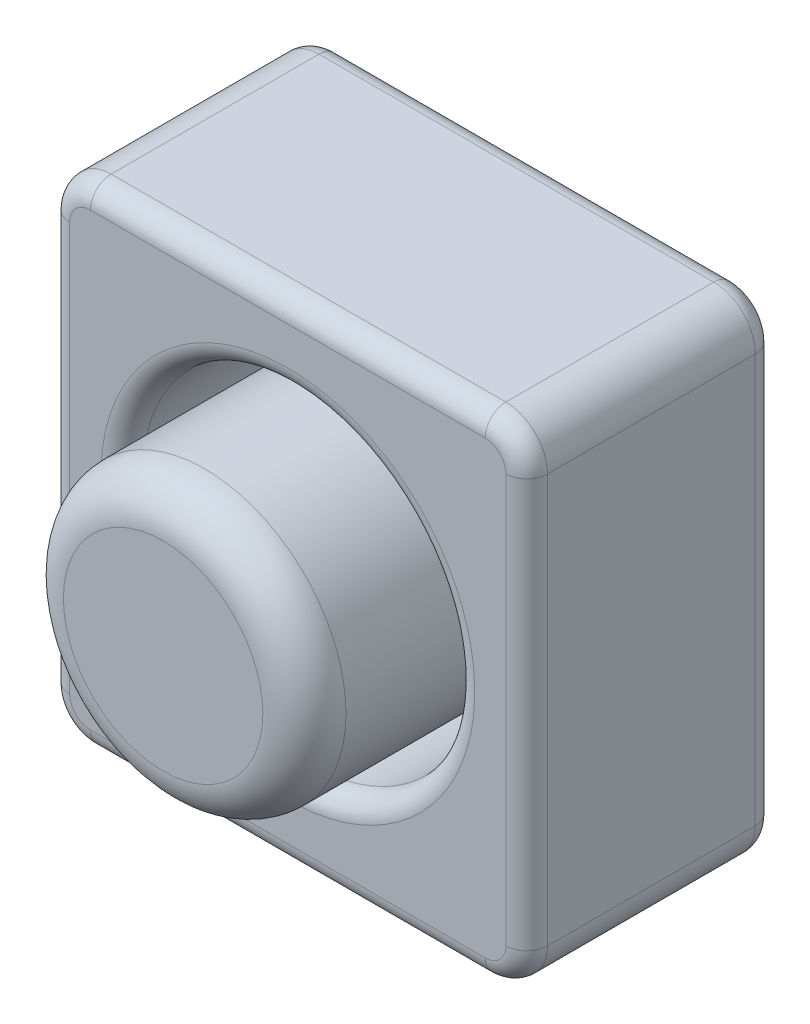
ISO-10303-21;
HEADER;
FILE_DESCRIPTION(('STEP AP214'),'2;1');
FILE_NAME('part.step','',(''),(''),'','','');
FILE_SCHEMA(('AUTOMOTIVE_DESIGN { 1 0 10303 214 1 1 1 1 }'));
ENDSEC;
DATA;
#1=APPLICATION_CONTEXT('core data for automotive mechanical design processes');
#2=APPLICATION_PROTOCOL_DEFINITION('international standard','automotive_design',2000,#1);
#3=PRODUCT_CONTEXT('',#1,'mechanical');
#4=PRODUCT('Part','Part','',(#3));
#5=PRODUCT_RELATED_PRODUCT_CATEGORY('part','',(#4));
#6=PRODUCT_DEFINITION_FORMATION('','',#4);
#7=PRODUCT_DEFINITION_CONTEXT('part definition',#1,'design');
#8=PRODUCT_DEFINITION('design','',#6,#7);
#9=PRODUCT_DEFINITION_SHAPE('','',#8);
#10=(LENGTH_UNIT() NAMED_UNIT(*) SI_UNIT(.MILLI.,.METRE.));
#11=(NAMED_UNIT(*) PLANE_ANGLE_UNIT() SI_UNIT($,.RADIAN.));
#12=(NAMED_UNIT(*) SI_UNIT($,.STERADIAN.) SOLID_ANGLE_UNIT());
#13=UNCERTAINTY_MEASURE_WITH_UNIT(LENGTH_MEASURE(1.E-05),#10,'distance_accuracy_value','');
#14=(GEOMETRIC_REPRESENTATION_CONTEXT(3) GLOBAL_UNCERTAINTY_ASSIGNED_CONTEXT((#13)) GLOBAL_UNIT_ASSIGNED_CONTEXT((#10,
#11,#12)) REPRESENTATION_CONTEXT('',''));
#15=CARTESIAN_POINT('',(0.,0.,0.));
#16=DIRECTION('',(0.,0.,1.));
#17=DIRECTION('',(1.,0.,0.));
#18=AXIS2_PLACEMENT_3D('',#15,#16,#17);
#19=CARTESIAN_POINT('',(-14.8289115387548,-6.46149501276,0.9));
#20=DIRECTION('',(0.,0.,-1.));
#21=DIRECTION('',(-1.,0.,0.));
#22=AXIS2_PLACEMENT_3D('',#19,#20,#21);
#23=PLANE('',#22);
#24=CARTESIAN_POINT('',(-17.3287625004657,-6.33649501276,0.9));
#25=DIRECTION('',(0.,0.,-1.));
#26=DIRECTION('',(-1.,0.,0.));
#27=AXIS2_PLACEMENT_3D('',#24,#25,#26);
#28=CIRCLE('',#27,0.125);
#29=CARTESIAN_POINT('',(-17.4537625004657,-6.33649501276,0.9));
#30=VERTEX_POINT('',#29);
#31=CARTESIAN_POINT('',(-17.3287625004657,-6.46149501276,0.9));
#32=VERTEX_POINT('',#31);
#33=EDGE_CURVE('E295',#30,#32,#28,.F.);
#34=ORIENTED_EDGE('',*,*,#33,.F.);
#35=DIRECTION('',(0.,-1.,0.));
#36=VECTOR('',#35,1.);
#37=CARTESIAN_POINT('',(-17.4537625004657,-5.10719648693996,0.899999999999999));
#38=LINE('',#37,#36);
#39=CARTESIAN_POINT('',(-17.4537625004657,-3.87789796111991,0.9));
#40=VERTEX_POINT('',#39);
#41=EDGE_CURVE('E309',#40,#30,#38,.T.);
#42=ORIENTED_EDGE('',*,*,#41,.F.);
#43=CARTESIAN_POINT('',(-17.3287625004657,-3.87789796111991,0.900000000000002));
#44=DIRECTION('',(0.,0.,-1.));
#45=DIRECTION('',(-1.,0.,0.));
#46=AXIS2_PLACEMENT_3D('',#43,#44,#45);
#47=CIRCLE('',#46,0.125);
#48=CARTESIAN_POINT('',(-17.3287625004657,-3.75289796111991,0.900000000000001));
#49=VERTEX_POINT('',#48);
#50=EDGE_CURVE('E319',#49,#40,#47,.F.);
#51=ORIENTED_EDGE('',*,*,#50,.F.);
#52=DIRECTION('',(-1.,0.,0.));
#53=VECTOR('',#52,1.);
#54=CARTESIAN_POINT('',(-16.1413370196103,-3.75289796111991,0.9));
#55=LINE('',#54,#53);
#56=CARTESIAN_POINT('',(-14.9539115387548,-3.75289796111991,0.900000000000001));
#57=VERTEX_POINT('',#56);
#58=EDGE_CURVE('E329',#57,#49,#55,.T.);
#59=ORIENTED_EDGE('',*,*,#58,.F.);
#60=CARTESIAN_POINT('',(-14.9539115387548,-3.87789796111991,0.900000000000001));
#61=DIRECTION('',(0.,0.,-1.));
#62=DIRECTION('',(-1.,0.,0.));
#63=AXIS2_PLACEMENT_3D('',#60,#61,#62);
#64=CIRCLE('',#63,0.125000000000002);
#65=CARTESIAN_POINT('',(-14.8289115387548,-3.87789796111991,0.9));
#66=VERTEX_POINT('',#65);
#67=EDGE_CURVE('E339',#66,#57,#64,.F.);
#68=ORIENTED_EDGE('',*,*,#67,.F.);
#69=DIRECTION('',(0.,1.,0.));
#70=VECTOR('',#69,1.);
#71=CARTESIAN_POINT('',(-14.8289115387548,-5.10719648693996,0.899999999999999));
#72=LINE('',#71,#70);
#73=CARTESIAN_POINT('',(-14.8289115387548,-6.33649501276,0.9));
#74=VERTEX_POINT('',#73);
#75=EDGE_CURVE('E349',#74,#66,#72,.T.);
#76=ORIENTED_EDGE('',*,*,#75,.F.);
#77=CARTESIAN_POINT('',(-14.9539115387548,-6.33649501276,0.900000000000001));
#78=DIRECTION('',(0.,0.,-1.));
#79=DIRECTION('',(-1.,0.,0.));
#80=AXIS2_PLACEMENT_3D('',#77,#78,#79);
#81=CIRCLE('',#80,0.125);
#82=CARTESIAN_POINT('',(-14.9539115387548,-6.46149501276,0.9));
#83=VERTEX_POINT('',#82);
#84=EDGE_CURVE('E20',#83,#74,#81,.F.);
#85=ORIENTED_EDGE('',*,*,#84,.F.);
#86=DIRECTION('',(1.,0.,0.));
#87=VECTOR('',#86,1.);
#88=CARTESIAN_POINT('',(-16.1413370196103,-6.46149501276,0.9));
#89=LINE('',#88,#87);
#90=EDGE_CURVE('E294',#32,#83,#89,.T.);
#91=ORIENTED_EDGE('',*,*,#90,.F.);
#92=EDGE_LOOP('',(#34,#42,#51,#59,#68,#76,#85,#91));
#93=FACE_BOUND('',#92,.T.);
#94=ADVANCED_FACE('F16',(#93),#23,.T.);
#95=CARTESIAN_POINT('',(-14.9539115387548,-6.33649501276,1.025));
#96=DIRECTION('',(0.,0.,-1.));
#97=DIRECTION('',(-1.,0.,0.));
#98=AXIS2_PLACEMENT_3D('',#95,#96,#97);
#99=TOROIDAL_SURFACE('',#98,0.125000000000004,0.124999999999999);
#100=CARTESIAN_POINT('',(-14.8289115387548,-6.33649501276,1.025));
#101=DIRECTION('',(0.,1.,0.));
#102=DIRECTION('',(0.,0.,1.));
#103=AXIS2_PLACEMENT_3D('',#100,#101,#102);
#104=CIRCLE('',#103,0.124999999999999);
#105=CARTESIAN_POINT('',(-14.7039115387548,-6.33649501276,1.025));
#106=VERTEX_POINT('',#105);
#107=EDGE_CURVE('E90',#106,#74,#104,.T.);
#108=ORIENTED_EDGE('',*,*,#107,.F.);
#109=CARTESIAN_POINT('',(-14.9539115387548,-6.33649501276,1.025));
#110=DIRECTION('',(0.,0.,1.));
#111=DIRECTION('',(1.,0.,0.));
#112=AXIS2_PLACEMENT_3D('',#109,#110,#111);
#113=CIRCLE('',#112,0.25);
#114=CARTESIAN_POINT('',(-14.9539115387548,-6.58649501276,1.025));
#115=VERTEX_POINT('',#114);
#116=EDGE_CURVE('E285',#115,#106,#113,.T.);
#117=ORIENTED_EDGE('',*,*,#116,.F.);
#118=CARTESIAN_POINT('',(-14.9539115387548,-6.46149501276,1.025));
#119=DIRECTION('',(-1.,0.,0.));
#120=DIRECTION('',(0.,0.,1.));
#121=AXIS2_PLACEMENT_3D('',#118,#119,#120);
#122=CIRCLE('',#121,0.124999999999999);
#123=EDGE_CURVE('E288',#83,#115,#122,.T.);
#124=ORIENTED_EDGE('',*,*,#123,.F.);
#125=ORIENTED_EDGE('',*,*,#84,.T.);
#126=EDGE_LOOP('',(#108,#117,#124,#125));
#127=FACE_BOUND('',#126,.T.);
#128=ADVANCED_FACE('F417',(#127),#99,.T.);
#129=CARTESIAN_POINT('',(-14.8289115387548,-6.33649501276,1.025));
#130=DIRECTION('',(0.,1.,0.));
#131=DIRECTION('',(0.,0.,1.));
#132=AXIS2_PLACEMENT_3D('',#129,#130,#131);
#133=CYLINDRICAL_SURFACE('',#132,0.124999999999999);
#134=CARTESIAN_POINT('',(-14.8289115387548,-3.87789796111991,1.025));
#135=DIRECTION('',(0.,1.,0.));
#136=DIRECTION('',(0.,0.,1.));
#137=AXIS2_PLACEMENT_3D('',#134,#135,#136);
#138=CIRCLE('',#137,0.125000000000001);
#139=CARTESIAN_POINT('',(-14.7039115387548,-3.87789796111991,1.025));
#140=VERTEX_POINT('',#139);
#141=EDGE_CURVE('E346',#140,#66,#138,.T.);
#142=ORIENTED_EDGE('',*,*,#141,.F.);
#143=DIRECTION('',(0.,1.,0.));
#144=VECTOR('',#143,1.);
#145=CARTESIAN_POINT('',(-14.7039115387548,-5.10719648693996,1.025));
#146=LINE('',#145,#144);
#147=EDGE_CURVE('E276',#106,#140,#146,.T.);
#148=ORIENTED_EDGE('',*,*,#147,.F.);
#149=ORIENTED_EDGE('',*,*,#107,.T.);
#150=ORIENTED_EDGE('',*,*,#75,.T.);
#151=EDGE_LOOP('',(#142,#148,#149,#150));
#152=FACE_BOUND('',#151,.T.);
#153=ADVANCED_FACE('F414',(#152),#133,.T.);
#154=CARTESIAN_POINT('',(-14.9539115387548,-3.87789796111991,1.025));
#155=DIRECTION('',(0.,0.,-1.));
#156=DIRECTION('',(-1.,0.,0.));
#157=AXIS2_PLACEMENT_3D('',#154,#155,#156);
#158=TOROIDAL_SURFACE('',#157,0.125000000000002,0.124999999999999);
#159=CARTESIAN_POINT('',(-14.9539115387548,-3.75289796111991,1.025));
#160=DIRECTION('',(-1.,0.,0.));
#161=DIRECTION('',(0.,0.,1.));
#162=AXIS2_PLACEMENT_3D('',#159,#160,#161);
#163=CIRCLE('',#162,0.124999999999999);
#164=CARTESIAN_POINT('',(-14.9539115387548,-3.62789796111991,1.025));
#165=VERTEX_POINT('',#164);
#166=EDGE_CURVE('E336',#165,#57,#163,.T.);
#167=ORIENTED_EDGE('',*,*,#166,.F.);
#168=CARTESIAN_POINT('',(-14.9539115387548,-3.87789796111991,1.025));
#169=DIRECTION('',(0.,0.,1.));
#170=DIRECTION('',(1.,0.,0.));
#171=AXIS2_PLACEMENT_3D('',#168,#169,#170);
#172=CIRCLE('',#171,0.250000000000001);
#173=EDGE_CURVE('E266',#140,#165,#172,.T.);
#174=ORIENTED_EDGE('',*,*,#173,.F.);
#175=ORIENTED_EDGE('',*,*,#141,.T.);
#176=ORIENTED_EDGE('',*,*,#67,.T.);
#177=EDGE_LOOP('',(#167,#174,#175,#176));
#178=FACE_BOUND('',#177,.T.);
#179=ADVANCED_FACE('F383',(#178),#158,.T.);
#180=CARTESIAN_POINT('',(-14.9539115387548,-3.75289796111991,1.025));
#181=DIRECTION('',(-1.,0.,0.));
#182=DIRECTION('',(0.,0.,1.));
#183=AXIS2_PLACEMENT_3D('',#180,#181,#182);
#184=CYLINDRICAL_SURFACE('',#183,0.124999999999999);
#185=CARTESIAN_POINT('',(-17.3287625004657,-3.75289796111991,1.025));
#186=DIRECTION('',(-1.,0.,0.));
#187=DIRECTION('',(0.,0.,1.));
#188=AXIS2_PLACEMENT_3D('',#185,#186,#187);
#189=CIRCLE('',#188,0.124999999999999);
#190=CARTESIAN_POINT('',(-17.3287625004657,-3.62789796111991,1.025));
#191=VERTEX_POINT('',#190);
#192=EDGE_CURVE('E326',#191,#49,#189,.T.);
#193=ORIENTED_EDGE('',*,*,#192,.F.);
#194=DIRECTION('',(-1.,0.,0.));
#195=VECTOR('',#194,1.);
#196=CARTESIAN_POINT('',(-16.1413370196103,-3.62789796111991,1.025));
#197=LINE('',#196,#195);
#198=EDGE_CURVE('E256',#165,#191,#197,.T.);
#199=ORIENTED_EDGE('',*,*,#198,.F.);
#200=ORIENTED_EDGE('',*,*,#166,.T.);
#201=ORIENTED_EDGE('',*,*,#58,.T.);
#202=EDGE_LOOP('',(#193,#199,#200,#201));
#203=FACE_BOUND('',#202,.T.);
#204=ADVANCED_FACE('F390',(#203),#184,.T.);
#205=CARTESIAN_POINT('',(-17.3287625004657,-3.87789796111991,1.025));
#206=DIRECTION('',(0.,0.,-1.));
#207=DIRECTION('',(-1.,0.,0.));
#208=AXIS2_PLACEMENT_3D('',#205,#206,#207);
#209=TOROIDAL_SURFACE('',#208,0.125000000000004,0.124999999999998);
#210=ORIENTED_EDGE('',*,*,#192,.T.);
#211=ORIENTED_EDGE('',*,*,#50,.T.);
#212=CARTESIAN_POINT('',(-17.4537625004657,-3.87789796111991,1.025));
#213=DIRECTION('',(0.,-1.,0.));
#214=DIRECTION('',(0.,0.,-1.));
#215=AXIS2_PLACEMENT_3D('',#212,#213,#214);
#216=CIRCLE('',#215,0.124999999999998);
#217=CARTESIAN_POINT('',(-17.5787625004657,-3.87789796111991,1.025));
#218=VERTEX_POINT('',#217);
#219=EDGE_CURVE('E316',#218,#40,#216,.T.);
#220=ORIENTED_EDGE('',*,*,#219,.F.);
#221=CARTESIAN_POINT('',(-17.3287625004657,-3.87789796111991,1.025));
#222=DIRECTION('',(0.,0.,1.));
#223=DIRECTION('',(1.,0.,0.));
#224=AXIS2_PLACEMENT_3D('',#221,#222,#223);
#225=CIRCLE('',#224,0.25);
#226=EDGE_CURVE('E246',#191,#218,#225,.T.);
#227=ORIENTED_EDGE('',*,*,#226,.F.);
#228=EDGE_LOOP('',(#210,#211,#220,#227));
#229=FACE_BOUND('',#228,.T.);
#230=ADVANCED_FACE('F427',(#229),#209,.T.);
#231=CARTESIAN_POINT('',(-17.4537625004657,-3.87789796111991,1.025));
#232=DIRECTION('',(0.,-1.,0.));
#233=DIRECTION('',(0.,0.,-1.));
#234=AXIS2_PLACEMENT_3D('',#231,#232,#233);
#235=CYLINDRICAL_SURFACE('',#234,0.124999999999998);
#236=CARTESIAN_POINT('',(-17.4537625004657,-6.33649501276,1.025));
#237=DIRECTION('',(0.,-1.,0.));
#238=DIRECTION('',(0.,0.,-1.));
#239=AXIS2_PLACEMENT_3D('',#236,#237,#238);
#240=CIRCLE('',#239,0.125);
#241=CARTESIAN_POINT('',(-17.5787625004657,-6.33649501276,1.025));
#242=VERTEX_POINT('',#241);
#243=EDGE_CURVE('E306',#242,#30,#240,.T.);
#244=ORIENTED_EDGE('',*,*,#243,.F.);
#245=DIRECTION('',(0.,-1.,0.));
#246=VECTOR('',#245,1.);
#247=CARTESIAN_POINT('',(-17.5787625004657,-5.10719648693996,1.025));
#248=LINE('',#247,#246);
#249=EDGE_CURVE('E236',#218,#242,#248,.T.);
#250=ORIENTED_EDGE('',*,*,#249,.F.);
#251=ORIENTED_EDGE('',*,*,#219,.T.);
#252=ORIENTED_EDGE('',*,*,#41,.T.);
#253=EDGE_LOOP('',(#244,#250,#251,#252));
#254=FACE_BOUND('',#253,.T.);
#255=ADVANCED_FACE('F425',(#254),#235,.T.);
#256=CARTESIAN_POINT('',(-17.3287625004657,-6.33649501276,1.025));
#257=DIRECTION('',(0.,0.,-1.));
#258=DIRECTION('',(-1.,0.,0.));
#259=AXIS2_PLACEMENT_3D('',#256,#257,#258);
#260=TOROIDAL_SURFACE('',#259,0.125000000000001,0.125);
#261=CARTESIAN_POINT('',(-17.3287625004657,-6.46149501276,1.025));
#262=DIRECTION('',(1.,0.,0.));
#263=DIRECTION('',(0.,0.,-1.));
#264=AXIS2_PLACEMENT_3D('',#261,#262,#263);
#265=CIRCLE('',#264,0.124999999999999);
#266=CARTESIAN_POINT('',(-17.3287625004657,-6.58649501276,1.025));
#267=VERTEX_POINT('',#266);
#268=EDGE_CURVE('E291',#267,#32,#265,.T.);
#269=ORIENTED_EDGE('',*,*,#268,.F.);
#270=CARTESIAN_POINT('',(-17.3287625004657,-6.33649501276,1.025));
#271=DIRECTION('',(0.,0.,1.));
#272=DIRECTION('',(1.,0.,0.));
#273=AXIS2_PLACEMENT_3D('',#270,#271,#272);
#274=CIRCLE('',#273,0.25);
#275=EDGE_CURVE('E144',#242,#267,#274,.T.);
#276=ORIENTED_EDGE('',*,*,#275,.F.);
#277=ORIENTED_EDGE('',*,*,#243,.T.);
#278=ORIENTED_EDGE('',*,*,#33,.T.);
#279=EDGE_LOOP('',(#269,#276,#277,#278));
#280=FACE_BOUND('',#279,.T.);
#281=ADVANCED_FACE('F422',(#280),#260,.T.);
#282=CARTESIAN_POINT('',(-17.3287625004657,-6.46149501276,1.025));
#283=DIRECTION('',(1.,0.,0.));
#284=DIRECTION('',(0.,0.,-1.));
#285=AXIS2_PLACEMENT_3D('',#282,#283,#284);
#286=CYLINDRICAL_SURFACE('',#285,0.124999999999999);
#287=ORIENTED_EDGE('',*,*,#123,.T.);
#288=DIRECTION('',(1.,0.,0.));
#289=VECTOR('',#288,1.);
#290=CARTESIAN_POINT('',(-16.1413370196103,-6.58649501276,1.025));
#291=LINE('',#290,#289);
#292=EDGE_CURVE('E222',#267,#115,#291,.T.);
#293=ORIENTED_EDGE('',*,*,#292,.F.);
#294=ORIENTED_EDGE('',*,*,#268,.T.);
#295=ORIENTED_EDGE('',*,*,#90,.T.);
#296=EDGE_LOOP('',(#287,#293,#294,#295));
#297=FACE_BOUND('',#296,.T.);
#298=ADVANCED_FACE('F420',(#297),#286,.T.);
#299=CARTESIAN_POINT('',(-14.9539115387548,-6.33649501276,2.275));
#300=DIRECTION('',(0.,0.,-1.));
#301=DIRECTION('',(-1.,0.,0.));
#302=AXIS2_PLACEMENT_3D('',#299,#300,#301);
#303=CYLINDRICAL_SURFACE('',#302,0.25);
#304=CARTESIAN_POINT('',(-14.9539115387548,-6.33649501276,2.275));
#305=DIRECTION('',(0.,0.,1.));
#306=DIRECTION('',(1.,0.,0.));
#307=AXIS2_PLACEMENT_3D('',#304,#305,#306);
#308=CIRCLE('',#307,0.25);
#309=CARTESIAN_POINT('',(-14.9539115387548,-6.58649501276,2.275));
#310=VERTEX_POINT('',#309);
#311=CARTESIAN_POINT('',(-14.7039115387548,-6.33649501276,2.275));
#312=VERTEX_POINT('',#311);
#313=EDGE_CURVE('E148',#310,#312,#308,.T.);
#314=ORIENTED_EDGE('',*,*,#313,.F.);
#315=DIRECTION('',(0.,0.,1.));
#316=VECTOR('',#315,1.);
#317=CARTESIAN_POINT('',(-14.9539115387548,-6.58649501276,1.65));
#318=LINE('',#317,#316);
#319=EDGE_CURVE('E149',#115,#310,#318,.T.);
#320=ORIENTED_EDGE('',*,*,#319,.F.);
#321=ORIENTED_EDGE('',*,*,#116,.T.);
#322=DIRECTION('',(0.,0.,-1.));
#323=VECTOR('',#322,1.);
#324=CARTESIAN_POINT('',(-14.7039115387548,-6.33649501276,1.65));
#325=LINE('',#324,#323);
#326=EDGE_CURVE('E273',#312,#106,#325,.T.);
#327=ORIENTED_EDGE('',*,*,#326,.F.);
#328=EDGE_LOOP('',(#314,#320,#321,#327));
#329=FACE_BOUND('',#328,.T.);
#330=ADVANCED_FACE('F416',(#329),#303,.T.);
#331=CARTESIAN_POINT('',(-14.7039115387548,-6.33649501276,1.025));
#332=DIRECTION('',(1.,0.,0.));
#333=DIRECTION('',(0.,1.,0.));
#334=AXIS2_PLACEMENT_3D('',#331,#332,#333);
#335=PLANE('',#334);
#336=DIRECTION('',(0.,1.,0.));
#337=VECTOR('',#336,1.);
#338=CARTESIAN_POINT('',(-14.7039115387548,-5.10719648693996,2.275));
#339=LINE('',#338,#337);
#340=CARTESIAN_POINT('',(-14.7039115387548,-3.87789796111991,2.275));
#341=VERTEX_POINT('',#340);
#342=EDGE_CURVE('E203',#312,#341,#339,.T.);
#343=ORIENTED_EDGE('',*,*,#342,.F.);
#344=ORIENTED_EDGE('',*,*,#326,.T.);
#345=ORIENTED_EDGE('',*,*,#147,.T.);
#346=DIRECTION('',(0.,0.,-1.));
#347=VECTOR('',#346,1.);
#348=CARTESIAN_POINT('',(-14.7039115387548,-3.87789796111991,1.65));
#349=LINE('',#348,#347);
#350=EDGE_CURVE('E263',#341,#140,#349,.T.);
#351=ORIENTED_EDGE('',*,*,#350,.F.);
#352=EDGE_LOOP('',(#343,#344,#345,#351));
#353=FACE_BOUND('',#352,.T.);
#354=ADVANCED_FACE('F412',(#353),#335,.T.);
#355=CARTESIAN_POINT('',(-14.9539115387548,-3.87789796111991,2.275));
#356=DIRECTION('',(0.,0.,-1.));
#357=DIRECTION('',(-1.,0.,0.));
#358=AXIS2_PLACEMENT_3D('',#355,#356,#357);
#359=CYLINDRICAL_SURFACE('',#358,0.250000000000001);
#360=CARTESIAN_POINT('',(-14.9539115387548,-3.87789796111991,2.275));
#361=DIRECTION('',(0.,0.,1.));
#362=DIRECTION('',(1.,0.,0.));
#363=AXIS2_PLACEMENT_3D('',#360,#361,#362);
#364=CIRCLE('',#363,0.250000000000001);
#365=CARTESIAN_POINT('',(-14.9539115387548,-3.62789796111991,2.275));
#366=VERTEX_POINT('',#365);
#367=EDGE_CURVE('E197',#341,#366,#364,.T.);
#368=ORIENTED_EDGE('',*,*,#367,.F.);
#369=ORIENTED_EDGE('',*,*,#350,.T.);
#370=ORIENTED_EDGE('',*,*,#173,.T.);
#371=DIRECTION('',(0.,0.,-1.));
#372=VECTOR('',#371,1.);
#373=CARTESIAN_POINT('',(-14.9539115387548,-3.62789796111991,1.65));
#374=LINE('',#373,#372);
#375=EDGE_CURVE('E253',#366,#165,#374,.T.);
#376=ORIENTED_EDGE('',*,*,#375,.F.);
#377=EDGE_LOOP('',(#368,#369,#370,#376));
#378=FACE_BOUND('',#377,.T.);
#379=ADVANCED_FACE('F395',(#378),#359,.T.);
#380=CARTESIAN_POINT('',(-14.9539115387548,-3.62789796111991,1.025));
#381=DIRECTION('',(0.,1.,0.));
#382=DIRECTION('',(-1.,0.,0.));
#383=AXIS2_PLACEMENT_3D('',#380,#381,#382);
#384=PLANE('',#383);
#385=DIRECTION('',(-1.,0.,0.));
#386=VECTOR('',#385,1.);
#387=CARTESIAN_POINT('',(-16.1413370196103,-3.62789796111991,2.275));
#388=LINE('',#387,#386);
#389=CARTESIAN_POINT('',(-17.3287625004657,-3.62789796111991,2.275));
#390=VERTEX_POINT('',#389);
#391=EDGE_CURVE('E191',#366,#390,#388,.T.);
#392=ORIENTED_EDGE('',*,*,#391,.F.);
#393=ORIENTED_EDGE('',*,*,#375,.T.);
#394=ORIENTED_EDGE('',*,*,#198,.T.);
#395=DIRECTION('',(0.,0.,-1.));
#396=VECTOR('',#395,1.);
#397=CARTESIAN_POINT('',(-17.3287625004657,-3.62789796111991,1.65));
#398=LINE('',#397,#396);
#399=EDGE_CURVE('E243',#390,#191,#398,.T.);
#400=ORIENTED_EDGE('',*,*,#399,.F.);
#401=EDGE_LOOP('',(#392,#393,#394,#400));
#402=FACE_BOUND('',#401,.T.);
#403=ADVANCED_FACE('F397',(#402),#384,.T.);
#404=CARTESIAN_POINT('',(-17.3287625004657,-3.87789796111991,2.275));
#405=DIRECTION('',(0.,0.,-1.));
#406=DIRECTION('',(-1.,0.,0.));
#407=AXIS2_PLACEMENT_3D('',#404,#405,#406);
#408=CYLINDRICAL_SURFACE('',#407,0.25);
#409=CARTESIAN_POINT('',(-17.3287625004657,-3.87789796111991,2.275));
#410=DIRECTION('',(0.,0.,1.));
#411=DIRECTION('',(1.,0.,0.));
#412=AXIS2_PLACEMENT_3D('',#409,#410,#411);
#413=CIRCLE('',#412,0.25);
#414=CARTESIAN_POINT('',(-17.5787625004657,-3.87789796111991,2.275));
#415=VERTEX_POINT('',#414);
#416=EDGE_CURVE('E185',#390,#415,#413,.T.);
#417=ORIENTED_EDGE('',*,*,#416,.F.);
#418=ORIENTED_EDGE('',*,*,#399,.T.);
#419=ORIENTED_EDGE('',*,*,#226,.T.);
#420=DIRECTION('',(0.,0.,-1.));
#421=VECTOR('',#420,1.);
#422=CARTESIAN_POINT('',(-17.5787625004657,-3.87789796111991,1.65));
#423=LINE('',#422,#421);
#424=EDGE_CURVE('E233',#415,#218,#423,.T.);
#425=ORIENTED_EDGE('',*,*,#424,.F.);
#426=EDGE_LOOP('',(#417,#418,#419,#425));
#427=FACE_BOUND('',#426,.T.);
#428=ADVANCED_FACE('F429',(#427),#408,.T.);
#429=CARTESIAN_POINT('',(-17.5787625004657,-3.87789796111991,1.025));
#430=DIRECTION('',(-1.,0.,0.));
#431=DIRECTION('',(0.,-1.,0.));
#432=AXIS2_PLACEMENT_3D('',#429,#430,#431);
#433=PLANE('',#432);
#434=DIRECTION('',(0.,-1.,0.));
#435=VECTOR('',#434,1.);
#436=CARTESIAN_POINT('',(-17.5787625004657,-5.10719648693996,2.275));
#437=LINE('',#436,#435);
#438=CARTESIAN_POINT('',(-17.5787625004657,-6.33649501276,2.275));
#439=VERTEX_POINT('',#438);
#440=EDGE_CURVE('E179',#415,#439,#437,.T.);
#441=ORIENTED_EDGE('',*,*,#440,.F.);
#442=ORIENTED_EDGE('',*,*,#424,.T.);
#443=ORIENTED_EDGE('',*,*,#249,.T.);
#444=DIRECTION('',(0.,0.,-1.));
#445=VECTOR('',#444,1.);
#446=CARTESIAN_POINT('',(-17.5787625004657,-6.33649501276,1.65));
#447=LINE('',#446,#445);
#448=EDGE_CURVE('E225',#439,#242,#447,.T.);
#449=ORIENTED_EDGE('',*,*,#448,.F.);
#450=EDGE_LOOP('',(#441,#442,#443,#449));
#451=FACE_BOUND('',#450,.T.);
#452=ADVANCED_FACE('F432',(#451),#433,.T.);
#453=CARTESIAN_POINT('',(-17.3287625004657,-6.33649501276,2.275));
#454=DIRECTION('',(0.,0.,-1.));
#455=DIRECTION('',(-1.,0.,0.));
#456=AXIS2_PLACEMENT_3D('',#453,#454,#455);
#457=CYLINDRICAL_SURFACE('',#456,0.25);
#458=CARTESIAN_POINT('',(-17.3287625004657,-6.33649501276,2.275));
#459=DIRECTION('',(0.,0.,1.));
#460=DIRECTION('',(1.,0.,0.));
#461=AXIS2_PLACEMENT_3D('',#458,#459,#460);
#462=CIRCLE('',#461,0.250000000000001);
#463=CARTESIAN_POINT('',(-17.3287625004657,-6.58649501276,2.275));
#464=VERTEX_POINT('',#463);
#465=EDGE_CURVE('E141',#439,#464,#462,.T.);
#466=ORIENTED_EDGE('',*,*,#465,.F.);
#467=ORIENTED_EDGE('',*,*,#448,.T.);
#468=ORIENTED_EDGE('',*,*,#275,.T.);
#469=DIRECTION('',(0.,0.,-1.));
#470=VECTOR('',#469,1.);
#471=CARTESIAN_POINT('',(-17.3287625004657,-6.58649501276,1.65));
#472=LINE('',#471,#470);
#473=EDGE_CURVE('E138',#464,#267,#472,.T.);
#474=ORIENTED_EDGE('',*,*,#473,.F.);
#475=EDGE_LOOP('',(#466,#467,#468,#474));
#476=FACE_BOUND('',#475,.T.);
#477=ADVANCED_FACE('F139',(#476),#457,.T.);
#478=CARTESIAN_POINT('',(-17.3287625004657,-6.58649501276,1.025));
#479=DIRECTION('',(0.,-1.,0.));
#480=DIRECTION('',(1.,0.,0.));
#481=AXIS2_PLACEMENT_3D('',#478,#479,#480);
#482=PLANE('',#481);
#483=DIRECTION('',(1.,0.,0.));
#484=VECTOR('',#483,1.);
#485=CARTESIAN_POINT('',(-16.1413370196103,-6.58649501276,2.275));
#486=LINE('',#485,#484);
#487=EDGE_CURVE('E157',#464,#310,#486,.T.);
#488=ORIENTED_EDGE('',*,*,#487,.F.);
#489=ORIENTED_EDGE('',*,*,#473,.T.);
#490=ORIENTED_EDGE('',*,*,#292,.T.);
#491=ORIENTED_EDGE('',*,*,#319,.T.);
#492=EDGE_LOOP('',(#488,#489,#490,#491));
#493=FACE_BOUND('',#492,.T.);
#494=ADVANCED_FACE('F158',(#493),#482,.T.);
#495=CARTESIAN_POINT('',(-14.9539115387548,-6.33649501276,2.275));
#496=DIRECTION('',(0.,0.,1.));
#497=DIRECTION('',(1.,0.,0.));
#498=AXIS2_PLACEMENT_3D('',#495,#496,#497);
#499=TOROIDAL_SURFACE('',#498,0.125,0.125);
#500=CARTESIAN_POINT('',(-14.8289115387548,-6.33649501276,2.275));
#501=DIRECTION('',(0.,1.,0.));
#502=DIRECTION('',(0.,0.,1.));
#503=AXIS2_PLACEMENT_3D('',#500,#501,#502);
#504=CIRCLE('',#503,0.125);
#505=CARTESIAN_POINT('',(-14.8289115387548,-6.33649501276,2.4));
#506=VERTEX_POINT('',#505);
#507=EDGE_CURVE('E206',#506,#312,#504,.T.);
#508=ORIENTED_EDGE('',*,*,#507,.F.);
#509=CARTESIAN_POINT('',(-14.9539115387548,-6.33649501276,2.4));
#510=DIRECTION('',(0.,0.,1.));
#511=DIRECTION('',(1.,0.,0.));
#512=AXIS2_PLACEMENT_3D('',#509,#510,#511);
#513=CIRCLE('',#512,0.125000000000002);
#514=CARTESIAN_POINT('',(-14.9539115387548,-6.46149501276,2.4));
#515=VERTEX_POINT('',#514);
#516=EDGE_CURVE('E162',#515,#506,#513,.T.);
#517=ORIENTED_EDGE('',*,*,#516,.F.);
#518=CARTESIAN_POINT('',(-14.9539115387548,-6.46149501276,2.275));
#519=DIRECTION('',(-1.,0.,0.));
#520=DIRECTION('',(0.,0.,1.));
#521=AXIS2_PLACEMENT_3D('',#518,#519,#520);
#522=CIRCLE('',#521,0.125);
#523=EDGE_CURVE('E153',#310,#515,#522,.T.);
#524=ORIENTED_EDGE('',*,*,#523,.F.);
#525=ORIENTED_EDGE('',*,*,#313,.T.);
#526=EDGE_LOOP('',(#508,#517,#524,#525));
#527=FACE_BOUND('',#526,.T.);
#528=ADVANCED_FACE('F601',(#527),#499,.T.);
#529=CARTESIAN_POINT('',(-14.8289115387548,-3.87789796111991,2.275));
#530=DIRECTION('',(0.,-1.,0.));
#531=DIRECTION('',(0.,0.,-1.));
#532=AXIS2_PLACEMENT_3D('',#529,#530,#531);
#533=CYLINDRICAL_SURFACE('',#532,0.125);
#534=ORIENTED_EDGE('',*,*,#507,.T.);
#535=ORIENTED_EDGE('',*,*,#342,.T.);
#536=CARTESIAN_POINT('',(-14.8289115387548,-3.87789796111991,2.275));
#537=DIRECTION('',(0.,1.,0.));
#538=DIRECTION('',(0.,0.,1.));
#539=AXIS2_PLACEMENT_3D('',#536,#537,#538);
#540=CIRCLE('',#539,0.125);
#541=CARTESIAN_POINT('',(-14.8289115387548,-3.87789796111991,2.4));
#542=VERTEX_POINT('',#541);
#543=EDGE_CURVE('E200',#542,#341,#540,.T.);
#544=ORIENTED_EDGE('',*,*,#543,.F.);
#545=DIRECTION('',(0.,1.,0.));
#546=VECTOR('',#545,1.);
#547=CARTESIAN_POINT('',(-14.8289115387548,-5.10719648693996,2.4));
#548=LINE('',#547,#546);
#549=EDGE_CURVE('E172',#506,#542,#548,.T.);
#550=ORIENTED_EDGE('',*,*,#549,.F.);
#551=EDGE_LOOP('',(#534,#535,#544,#550));
#552=FACE_BOUND('',#551,.T.);
#553=ADVANCED_FACE('F409',(#552),#533,.T.);
#554=CARTESIAN_POINT('',(-14.9539115387548,-3.87789796111991,2.275));
#555=DIRECTION('',(0.,0.,1.));
#556=DIRECTION('',(1.,0.,0.));
#557=AXIS2_PLACEMENT_3D('',#554,#555,#556);
#558=TOROIDAL_SURFACE('',#557,0.125000000000002,0.125);
#559=ORIENTED_EDGE('',*,*,#543,.T.);
#560=ORIENTED_EDGE('',*,*,#367,.T.);
#561=CARTESIAN_POINT('',(-14.9539115387548,-3.75289796111991,2.275));
#562=DIRECTION('',(-1.,0.,0.));
#563=DIRECTION('',(0.,0.,1.));
#564=AXIS2_PLACEMENT_3D('',#561,#562,#563);
#565=CIRCLE('',#564,0.125);
#566=CARTESIAN_POINT('',(-14.9539115387548,-3.75289796111991,2.4));
#567=VERTEX_POINT('',#566);
#568=EDGE_CURVE('E194',#567,#366,#565,.T.);
#569=ORIENTED_EDGE('',*,*,#568,.F.);
#570=CARTESIAN_POINT('',(-14.9539115387548,-3.87789796111991,2.4));
#571=DIRECTION('',(0.,0.,1.));
#572=DIRECTION('',(1.,0.,0.));
#573=AXIS2_PLACEMENT_3D('',#570,#571,#572);
#574=CIRCLE('',#573,0.125);
#575=EDGE_CURVE('E374',#542,#567,#574,.T.);
#576=ORIENTED_EDGE('',*,*,#575,.F.);
#577=EDGE_LOOP('',(#559,#560,#569,#576));
#578=FACE_BOUND('',#577,.T.);
#579=ADVANCED_FACE('F405',(#578),#558,.T.);
#580=CARTESIAN_POINT('',(-17.3287625004657,-3.75289796111991,2.275));
#581=DIRECTION('',(1.,0.,0.));
#582=DIRECTION('',(0.,0.,-1.));
#583=AXIS2_PLACEMENT_3D('',#580,#581,#582);
#584=CYLINDRICAL_SURFACE('',#583,0.125);
#585=ORIENTED_EDGE('',*,*,#568,.T.);
#586=ORIENTED_EDGE('',*,*,#391,.T.);
#587=CARTESIAN_POINT('',(-17.3287625004657,-3.75289796111991,2.275));
#588=DIRECTION('',(-1.,0.,0.));
#589=DIRECTION('',(0.,0.,1.));
#590=AXIS2_PLACEMENT_3D('',#587,#588,#589);
#591=CIRCLE('',#590,0.125);
#592=CARTESIAN_POINT('',(-17.3287625004657,-3.75289796111991,2.4));
#593=VERTEX_POINT('',#592);
#594=EDGE_CURVE('E188',#593,#390,#591,.T.);
#595=ORIENTED_EDGE('',*,*,#594,.F.);
#596=DIRECTION('',(-1.,0.,0.));
#597=VECTOR('',#596,1.);
#598=CARTESIAN_POINT('',(-16.1413370196102,-3.75289796111991,2.4));
#599=LINE('',#598,#597);
#600=EDGE_CURVE('E373',#567,#593,#599,.T.);
#601=ORIENTED_EDGE('',*,*,#600,.F.);
#602=EDGE_LOOP('',(#585,#586,#595,#601));
#603=FACE_BOUND('',#602,.T.);
#604=ADVANCED_FACE('F401',(#603),#584,.T.);
#605=CARTESIAN_POINT('',(-17.3287625004657,-3.87789796111991,2.275));
#606=DIRECTION('',(0.,0.,1.));
#607=DIRECTION('',(1.,0.,0.));
#608=AXIS2_PLACEMENT_3D('',#605,#606,#607);
#609=TOROIDAL_SURFACE('',#608,0.125,0.125);
#610=ORIENTED_EDGE('',*,*,#594,.T.);
#611=ORIENTED_EDGE('',*,*,#416,.T.);
#612=CARTESIAN_POINT('',(-17.4537625004657,-3.87789796111991,2.275));
#613=DIRECTION('',(0.,-1.,0.));
#614=DIRECTION('',(0.,0.,-1.));
#615=AXIS2_PLACEMENT_3D('',#612,#613,#614);
#616=CIRCLE('',#615,0.125);
#617=CARTESIAN_POINT('',(-17.4537625004657,-3.87789796111991,2.4));
#618=VERTEX_POINT('',#617);
#619=EDGE_CURVE('E182',#618,#415,#616,.T.);
#620=ORIENTED_EDGE('',*,*,#619,.F.);
#621=CARTESIAN_POINT('',(-17.3287625004657,-3.87789796111991,2.4));
#622=DIRECTION('',(0.,0.,1.));
#623=DIRECTION('',(1.,0.,0.));
#624=AXIS2_PLACEMENT_3D('',#621,#622,#623);
#625=CIRCLE('',#624,0.125);
#626=EDGE_CURVE('E370',#593,#618,#625,.T.);
#627=ORIENTED_EDGE('',*,*,#626,.F.);
#628=EDGE_LOOP('',(#610,#611,#620,#627));
#629=FACE_BOUND('',#628,.T.);
#630=ADVANCED_FACE('F439',(#629),#609,.T.);
#631=CARTESIAN_POINT('',(-17.4537625004657,-6.33649501276,2.275));
#632=DIRECTION('',(0.,1.,0.));
#633=DIRECTION('',(0.,0.,1.));
#634=AXIS2_PLACEMENT_3D('',#631,#632,#633);
#635=CYLINDRICAL_SURFACE('',#634,0.125);
#636=ORIENTED_EDGE('',*,*,#619,.T.);
#637=ORIENTED_EDGE('',*,*,#440,.T.);
#638=CARTESIAN_POINT('',(-17.4537625004657,-6.33649501276,2.275));
#639=DIRECTION('',(0.,-1.,0.));
#640=DIRECTION('',(0.,0.,-1.));
#641=AXIS2_PLACEMENT_3D('',#638,#639,#640);
#642=CIRCLE('',#641,0.124999999999999);
#643=CARTESIAN_POINT('',(-17.4537625004657,-6.33649501276,2.4));
#644=VERTEX_POINT('',#643);
#645=EDGE_CURVE('E152',#644,#439,#642,.T.);
#646=ORIENTED_EDGE('',*,*,#645,.F.);
#647=DIRECTION('',(0.,-1.,0.));
#648=VECTOR('',#647,1.);
#649=CARTESIAN_POINT('',(-17.4537625004657,-5.10719648693996,2.4));
#650=LINE('',#649,#648);
#651=EDGE_CURVE('E369',#618,#644,#650,.T.);
#652=ORIENTED_EDGE('',*,*,#651,.F.);
#653=EDGE_LOOP('',(#636,#637,#646,#652));
#654=FACE_BOUND('',#653,.T.);
#655=ADVANCED_FACE('F435',(#654),#635,.T.);
#656=CARTESIAN_POINT('',(-17.3287625004657,-6.33649501276,2.275));
#657=DIRECTION('',(0.,0.,1.));
#658=DIRECTION('',(1.,0.,0.));
#659=AXIS2_PLACEMENT_3D('',#656,#657,#658);
#660=TOROIDAL_SURFACE('',#659,0.125,0.124999999999999);
#661=ORIENTED_EDGE('',*,*,#645,.T.);
#662=ORIENTED_EDGE('',*,*,#465,.T.);
#663=CARTESIAN_POINT('',(-17.3287625004657,-6.46149501276,2.275));
#664=DIRECTION('',(1.,0.,0.));
#665=DIRECTION('',(0.,0.,-1.));
#666=AXIS2_PLACEMENT_3D('',#663,#664,#665);
#667=CIRCLE('',#666,0.125);
#668=CARTESIAN_POINT('',(-17.3287625004657,-6.46149501276,2.4));
#669=VERTEX_POINT('',#668);
#670=EDGE_CURVE('E35',#669,#464,#667,.T.);
#671=ORIENTED_EDGE('',*,*,#670,.F.);
#672=CARTESIAN_POINT('',(-17.3287625004657,-6.33649501276,2.4));
#673=DIRECTION('',(0.,0.,1.));
#674=DIRECTION('',(1.,0.,0.));
#675=AXIS2_PLACEMENT_3D('',#672,#673,#674);
#676=CIRCLE('',#675,0.125);
#677=EDGE_CURVE('E367',#644,#669,#676,.T.);
#678=ORIENTED_EDGE('',*,*,#677,.F.);
#679=EDGE_LOOP('',(#661,#662,#671,#678));
#680=FACE_BOUND('',#679,.T.);
#681=ADVANCED_FACE('F151',(#680),#660,.T.);
#682=CARTESIAN_POINT('',(-14.9539115387548,-6.46149501276,2.275));
#683=DIRECTION('',(-1.,0.,0.));
#684=DIRECTION('',(0.,0.,1.));
#685=AXIS2_PLACEMENT_3D('',#682,#683,#684);
#686=CYLINDRICAL_SURFACE('',#685,0.125);
#687=ORIENTED_EDGE('',*,*,#670,.T.);
#688=ORIENTED_EDGE('',*,*,#487,.T.);
#689=ORIENTED_EDGE('',*,*,#523,.T.);
#690=DIRECTION('',(1.,0.,0.));
#691=VECTOR('',#690,1.);
#692=CARTESIAN_POINT('',(-16.1413370196102,-6.46149501276,2.4));
#693=LINE('',#692,#691);
#694=EDGE_CURVE('E166',#669,#515,#693,.T.);
#695=ORIENTED_EDGE('',*,*,#694,.F.);
#696=EDGE_LOOP('',(#687,#688,#689,#695));
#697=FACE_BOUND('',#696,.T.);
#698=ADVANCED_FACE('F164',(#697),#686,.T.);
#699=CARTESIAN_POINT('',(-17.4537625004657,-6.46149501276,2.4));
#700=DIRECTION('',(0.,0.,1.));
#701=DIRECTION('',(1.,0.,0.));
#702=AXIS2_PLACEMENT_3D('',#699,#700,#701);
#703=PLANE('',#702);
#704=CARTESIAN_POINT('',(-16.1413370196103,-5.10719648693996,2.4));
#705=DIRECTION('',(0.,0.,-1.));
#706=DIRECTION('',(-1.,0.,0.));
#707=AXIS2_PLACEMENT_3D('',#704,#705,#706);
#708=CIRCLE('',#707,1.125);
#709=CARTESIAN_POINT('',(-17.2663370196103,-5.10719648693996,2.4));
#710=VERTEX_POINT('',#709);
#711=EDGE_CURVE('E363',#710,#710,#708,.F.);
#712=ORIENTED_EDGE('',*,*,#711,.F.);
#713=EDGE_LOOP('',(#712));
#714=FACE_BOUND('',#713,.T.);
#715=ORIENTED_EDGE('',*,*,#677,.T.);
#716=ORIENTED_EDGE('',*,*,#694,.T.);
#717=ORIENTED_EDGE('',*,*,#516,.T.);
#718=ORIENTED_EDGE('',*,*,#549,.T.);
#719=ORIENTED_EDGE('',*,*,#575,.T.);
#720=ORIENTED_EDGE('',*,*,#600,.T.);
#721=ORIENTED_EDGE('',*,*,#626,.T.);
#722=ORIENTED_EDGE('',*,*,#651,.T.);
#723=EDGE_LOOP('',(#715,#716,#717,#718,#719,#720,#721,#722));
#724=FACE_BOUND('',#723,.T.);
#725=ADVANCED_FACE('F441',(#714,#724),#703,.T.);
#726=CARTESIAN_POINT('',(-16.1413370196103,-5.10719648693996,2.275));
#727=DIRECTION('',(0.,0.,-1.));
#728=DIRECTION('',(-1.,0.,0.));
#729=AXIS2_PLACEMENT_3D('',#726,#727,#728);
#730=TOROIDAL_SURFACE('',#729,1.125,0.124999999999999);
#731=CARTESIAN_POINT('',(-16.1413370196103,-5.10719648693996,2.275));
#732=DIRECTION('',(0.,0.,1.));
#733=DIRECTION('',(1.,0.,0.));
#734=AXIS2_PLACEMENT_3D('',#731,#732,#733);
#735=CIRCLE('',#734,1.);
#736=CARTESIAN_POINT('',(-15.1413370196103,-5.10719648693996,2.275));
#737=VERTEX_POINT('',#736);
#738=EDGE_CURVE('E366',#737,#737,#735,.T.);
#739=ORIENTED_EDGE('',*,*,#738,.F.);
#740=EDGE_LOOP('',(#739));
#741=FACE_BOUND('',#740,.T.);
#742=ORIENTED_EDGE('',*,*,#711,.T.);
#743=EDGE_LOOP('',(#742));
#744=FACE_BOUND('',#743,.T.);
#745=ADVANCED_FACE('F516',(#741,#744),#730,.T.);
#746=CARTESIAN_POINT('',(-16.1413370196103,-5.10719648693996,2.275));
#747=DIRECTION('',(0.,0.,-1.));
#748=DIRECTION('',(-1.,0.,0.));
#749=AXIS2_PLACEMENT_3D('',#746,#747,#748);
#750=CYLINDRICAL_SURFACE('',#749,1.);
#751=CARTESIAN_POINT('',(-16.1413370196103,-5.10719648693996,1.275));
#752=DIRECTION('',(0.,0.,1.));
#753=DIRECTION('',(1.,0.,0.));
#754=AXIS2_PLACEMENT_3D('',#751,#752,#753);
#755=CIRCLE('',#754,0.999999999999996);
#756=CARTESIAN_POINT('',(-15.1413370196103,-5.10719648693996,1.275));
#757=VERTEX_POINT('',#756);
#758=EDGE_CURVE('E447',#757,#757,#755,.T.);
#759=ORIENTED_EDGE('',*,*,#758,.F.);
#760=EDGE_LOOP('',(#759));
#761=FACE_BOUND('',#760,.T.);
#762=ORIENTED_EDGE('',*,*,#738,.T.);
#763=EDGE_LOOP('',(#762));
#764=FACE_BOUND('',#763,.T.);
#765=ADVANCED_FACE('F472',(#761,#764),#750,.F.);
#766=CARTESIAN_POINT('',(-16.1413370196103,-5.10719648693996,1.275));
#767=DIRECTION('',(0.,0.,-1.));
#768=DIRECTION('',(-1.,0.,0.));
#769=AXIS2_PLACEMENT_3D('',#766,#767,#768);
#770=TOROIDAL_SURFACE('',#769,0.875000000000001,0.125);
#771=ORIENTED_EDGE('',*,*,#758,.T.);
#772=EDGE_LOOP('',(#771));
#773=FACE_BOUND('',#772,.T.);
#774=CARTESIAN_POINT('',(-16.1413370196103,-5.10719648693996,1.15));
#775=DIRECTION('',(0.,0.,1.));
#776=DIRECTION('',(1.,0.,0.));
#777=AXIS2_PLACEMENT_3D('',#774,#775,#776);
#778=CIRCLE('',#777,0.875);
#779=CARTESIAN_POINT('',(-15.2663370196103,-5.10719648693996,1.15));
#780=VERTEX_POINT('',#779);
#781=EDGE_CURVE('E450',#780,#780,#778,.T.);
#782=ORIENTED_EDGE('',*,*,#781,.F.);
#783=EDGE_LOOP('',(#782));
#784=FACE_BOUND('',#783,.T.);
#785=ADVANCED_FACE('F462',(#773,#784),#770,.F.);
#786=CARTESIAN_POINT('',(-16.1413370196103,-5.10719648693996,1.225));
#787=DIRECTION('',(0.,0.,-1.));
#788=DIRECTION('',(-1.,0.,0.));
#789=AXIS2_PLACEMENT_3D('',#786,#787,#788);
#790=TOROIDAL_SURFACE('',#789,0.974999999999972,0.124999999999977);
#791=ORIENTED_EDGE('',*,*,#781,.T.);
#792=EDGE_LOOP('',(#791));
#793=FACE_BOUND('',#792,.T.);
#794=CARTESIAN_POINT('',(-16.1413370196103,-5.10719648693996,1.225));
#795=DIRECTION('',(0.,0.,1.));
#796=DIRECTION('',(1.,0.,0.));
#797=AXIS2_PLACEMENT_3D('',#794,#795,#796);
#798=CIRCLE('',#797,0.850000000000001);
#799=CARTESIAN_POINT('',(-15.2913370196103,-5.10719648693996,1.225));
#800=VERTEX_POINT('',#799);
#801=EDGE_CURVE('E362',#800,#800,#798,.T.);
#802=ORIENTED_EDGE('',*,*,#801,.F.);
#803=EDGE_LOOP('',(#802));
#804=FACE_BOUND('',#803,.T.);
#805=ADVANCED_FACE('F459',(#793,#804),#790,.F.);
#806=CARTESIAN_POINT('',(-16.7413370196103,-5.71919648693996,3.15));
#807=DIRECTION('',(0.,0.,1.));
#808=DIRECTION('',(1.,0.,0.));
#809=AXIS2_PLACEMENT_3D('',#806,#807,#808);
#810=PLANE('',#809);
#811=CARTESIAN_POINT('',(-16.1413370196103,-5.10719648693996,3.15));
#812=DIRECTION('',(0.,0.,1.));
#813=DIRECTION('',(1.,0.,0.));
#814=AXIS2_PLACEMENT_3D('',#811,#812,#813);
#815=CIRCLE('',#814,0.599999999999996);
#816=CARTESIAN_POINT('',(-15.5413370196103,-5.10719648693996,3.15));
#817=VERTEX_POINT('',#816);
#818=EDGE_CURVE('E26',#817,#817,#815,.F.);
#819=ORIENTED_EDGE('',*,*,#818,.F.);
#820=EDGE_LOOP('',(#819));
#821=FACE_BOUND('',#820,.T.);
#822=ADVANCED_FACE('F461',(#821),#810,.T.);
#823=CARTESIAN_POINT('',(-16.1413370196103,-5.10719648693996,2.9));
#824=DIRECTION('',(0.,0.,-1.));
#825=DIRECTION('',(-1.,0.,0.));
#826=AXIS2_PLACEMENT_3D('',#823,#824,#825);
#827=CYLINDRICAL_SURFACE('',#826,0.850000000000001);
#828=ORIENTED_EDGE('',*,*,#801,.T.);
#829=EDGE_LOOP('',(#828));
#830=FACE_BOUND('',#829,.T.);
#831=CARTESIAN_POINT('',(-16.1413370196103,-5.10719648693996,2.9));
#832=DIRECTION('',(0.,0.,1.));
#833=DIRECTION('',(1.,0.,0.));
#834=AXIS2_PLACEMENT_3D('',#831,#832,#833);
#835=CIRCLE('',#834,0.849999999999994);
#836=CARTESIAN_POINT('',(-15.2913370196103,-5.10719648693996,2.9));
#837=VERTEX_POINT('',#836);
#838=EDGE_CURVE('E11',#837,#837,#835,.T.);
#839=ORIENTED_EDGE('',*,*,#838,.F.);
#840=EDGE_LOOP('',(#839));
#841=FACE_BOUND('',#840,.T.);
#842=ADVANCED_FACE('F456',(#830,#841),#827,.T.);
#843=CARTESIAN_POINT('',(-16.1413370196103,-5.10719648693996,2.9));
#844=DIRECTION('',(0.,0.,1.));
#845=DIRECTION('',(1.,0.,0.));
#846=AXIS2_PLACEMENT_3D('',#843,#844,#845);
#847=TOROIDAL_SURFACE('',#846,0.599999999999996,0.25);
#848=ORIENTED_EDGE('',*,*,#838,.T.);
#849=EDGE_LOOP('',(#848));
#850=FACE_BOUND('',#849,.T.);
#851=ORIENTED_EDGE('',*,*,#818,.T.);
#852=EDGE_LOOP('',(#851));
#853=FACE_BOUND('',#852,.T.);
#854=ADVANCED_FACE('F18',(#850,#853),#847,.T.);
#855=CLOSED_SHELL('',(#94,#128,#153,#179,#204,#230,#255,#281,#298,#330,#354,#379,#403,#428,#452,
#477,#494,#528,#553,#579,#604,#630,#655,#681,#698,#725,#745,#765,#785,#805,#822,#842,#854));
#856=MANIFOLD_SOLID_BREP('B1',#855);
#857=ADVANCED_BREP_SHAPE_REPRESENTATION('',(#18,#856),#14);
#858=SHAPE_DEFINITION_REPRESENTATION(#9,#857);
ENDSEC;
END-ISO-10303-21;
